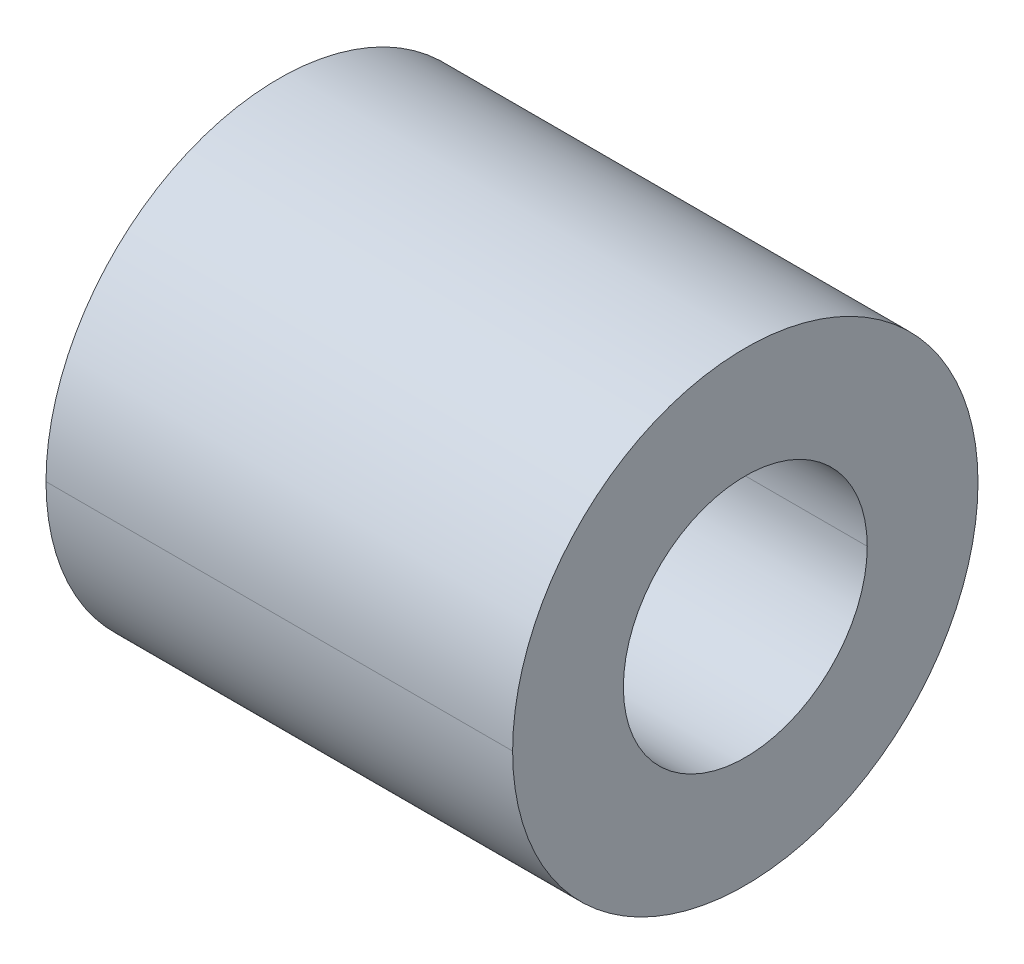
ISO-10303-21;
HEADER;
FILE_DESCRIPTION(('STEP AP214'),'2;1');
FILE_NAME('part.step','',(''),(''),'','','');
FILE_SCHEMA(('AUTOMOTIVE_DESIGN { 1 0 10303 214 1 1 1 1 }'));
ENDSEC;
DATA;
#1=APPLICATION_CONTEXT('core data for automotive mechanical design processes');
#2=APPLICATION_PROTOCOL_DEFINITION('international standard','automotive_design',2000,#1);
#3=PRODUCT_CONTEXT('',#1,'mechanical');
#4=PRODUCT('Part','Part','',(#3));
#5=PRODUCT_RELATED_PRODUCT_CATEGORY('part','',(#4));
#6=PRODUCT_DEFINITION_FORMATION('','',#4);
#7=PRODUCT_DEFINITION_CONTEXT('part definition',#1,'design');
#8=PRODUCT_DEFINITION('design','',#6,#7);
#9=PRODUCT_DEFINITION_SHAPE('','',#8);
#10=(LENGTH_UNIT() NAMED_UNIT(*) SI_UNIT(.MILLI.,.METRE.));
#11=(NAMED_UNIT(*) PLANE_ANGLE_UNIT() SI_UNIT($,.RADIAN.));
#12=(NAMED_UNIT(*) SI_UNIT($,.STERADIAN.) SOLID_ANGLE_UNIT());
#13=UNCERTAINTY_MEASURE_WITH_UNIT(LENGTH_MEASURE(1.E-05),#10,'distance_accuracy_value','');
#14=(GEOMETRIC_REPRESENTATION_CONTEXT(3) GLOBAL_UNCERTAINTY_ASSIGNED_CONTEXT((#13)) GLOBAL_UNIT_ASSIGNED_CONTEXT((#10,
#11,#12)) REPRESENTATION_CONTEXT('',''));
#15=CARTESIAN_POINT('',(0.,0.,0.));
#16=DIRECTION('',(0.,0.,1.));
#17=DIRECTION('',(1.,0.,0.));
#18=AXIS2_PLACEMENT_3D('',#15,#16,#17);
#19=CARTESIAN_POINT('',(4.7625,0.,0.));
#20=DIRECTION('',(-1.,0.,0.));
#21=DIRECTION('',(0.,0.,1.));
#22=AXIS2_PLACEMENT_3D('',#19,#20,#21);
#23=CYLINDRICAL_SURFACE('',#22,2.4892);
#24=DIRECTION('',(-1.,0.,0.));
#25=VECTOR('',#24,1.);
#26=CARTESIAN_POINT('',(4.7625,0.,-2.4892));
#27=LINE('',#26,#25);
#28=CARTESIAN_POINT('',(4.7625,0.,-2.4892));
#29=VERTEX_POINT('',#28);
#30=CARTESIAN_POINT('',(-4.7625,0.,-2.4892));
#31=VERTEX_POINT('',#30);
#32=EDGE_CURVE('E83',#29,#31,#27,.T.);
#33=ORIENTED_EDGE('',*,*,#32,.F.);
#34=CARTESIAN_POINT('',(4.7625,0.,0.));
#35=DIRECTION('',(1.,0.,0.));
#36=DIRECTION('',(0.,0.,-1.));
#37=AXIS2_PLACEMENT_3D('',#34,#35,#36);
#38=CIRCLE('',#37,2.4892);
#39=CARTESIAN_POINT('',(4.7625,0.,2.4892));
#40=VERTEX_POINT('',#39);
#41=EDGE_CURVE('E75',#29,#40,#38,.T.);
#42=ORIENTED_EDGE('',*,*,#41,.T.);
#43=DIRECTION('',(-1.,0.,0.));
#44=VECTOR('',#43,1.);
#45=CARTESIAN_POINT('',(4.7625,0.,2.4892));
#46=LINE('',#45,#44);
#47=CARTESIAN_POINT('',(-4.7625,0.,2.4892));
#48=VERTEX_POINT('',#47);
#49=EDGE_CURVE('E74',#40,#48,#46,.T.);
#50=ORIENTED_EDGE('',*,*,#49,.T.);
#51=CARTESIAN_POINT('',(-4.7625,0.,0.));
#52=DIRECTION('',(1.,0.,0.));
#53=DIRECTION('',(0.,0.,-1.));
#54=AXIS2_PLACEMENT_3D('',#51,#52,#53);
#55=CIRCLE('',#54,2.4892);
#56=EDGE_CURVE('E10',#31,#48,#55,.T.);
#57=ORIENTED_EDGE('',*,*,#56,.F.);
#58=EDGE_LOOP('',(#33,#42,#50,#57));
#59=FACE_BOUND('',#58,.T.);
#60=ADVANCED_FACE('F16',(#59),#23,.F.);
#61=CARTESIAN_POINT('',(4.7625,0.,0.));
#62=DIRECTION('',(-1.,0.,0.));
#63=DIRECTION('',(0.,0.,1.));
#64=AXIS2_PLACEMENT_3D('',#61,#62,#63);
#65=CYLINDRICAL_SURFACE('',#64,4.7498);
#66=DIRECTION('',(-1.,0.,0.));
#67=VECTOR('',#66,1.);
#68=CARTESIAN_POINT('',(4.7625,0.,-4.7498));
#69=LINE('',#68,#67);
#70=CARTESIAN_POINT('',(4.7625,0.,-4.7498));
#71=VERTEX_POINT('',#70);
#72=CARTESIAN_POINT('',(-4.7625,0.,-4.7498));
#73=VERTEX_POINT('',#72);
#74=EDGE_CURVE('E93',#71,#73,#69,.T.);
#75=ORIENTED_EDGE('',*,*,#74,.F.);
#76=CARTESIAN_POINT('',(4.7625,0.,0.));
#77=DIRECTION('',(1.,0.,0.));
#78=DIRECTION('',(0.,0.,-1.));
#79=AXIS2_PLACEMENT_3D('',#76,#77,#78);
#80=CIRCLE('',#79,4.7498);
#81=CARTESIAN_POINT('',(4.7625,0.,4.7498));
#82=VERTEX_POINT('',#81);
#83=EDGE_CURVE('E101',#82,#71,#80,.T.);
#84=ORIENTED_EDGE('',*,*,#83,.F.);
#85=DIRECTION('',(-1.,0.,0.));
#86=VECTOR('',#85,1.);
#87=CARTESIAN_POINT('',(4.7625,0.,4.7498));
#88=LINE('',#87,#86);
#89=CARTESIAN_POINT('',(-4.7625,0.,4.7498));
#90=VERTEX_POINT('',#89);
#91=EDGE_CURVE('E20',#82,#90,#88,.T.);
#92=ORIENTED_EDGE('',*,*,#91,.T.);
#93=CARTESIAN_POINT('',(-4.7625,0.,0.));
#94=DIRECTION('',(1.,0.,0.));
#95=DIRECTION('',(0.,0.,-1.));
#96=AXIS2_PLACEMENT_3D('',#93,#94,#95);
#97=CIRCLE('',#96,4.7498);
#98=EDGE_CURVE('E27',#90,#73,#97,.T.);
#99=ORIENTED_EDGE('',*,*,#98,.T.);
#100=EDGE_LOOP('',(#75,#84,#92,#99));
#101=FACE_BOUND('',#100,.T.);
#102=ADVANCED_FACE('F18',(#101),#65,.T.);
#103=CARTESIAN_POINT('',(-4.7625,0.,0.));
#104=DIRECTION('',(1.,0.,0.));
#105=DIRECTION('',(0.,1.,0.));
#106=AXIS2_PLACEMENT_3D('',#103,#104,#105);
#107=PLANE('',#106);
#108=CARTESIAN_POINT('',(-4.7625,0.,0.));
#109=DIRECTION('',(1.,0.,0.));
#110=DIRECTION('',(0.,0.,-1.));
#111=AXIS2_PLACEMENT_3D('',#108,#109,#110);
#112=CIRCLE('',#111,2.4892);
#113=EDGE_CURVE('E68',#48,#31,#112,.T.);
#114=ORIENTED_EDGE('',*,*,#113,.T.);
#115=ORIENTED_EDGE('',*,*,#56,.T.);
#116=EDGE_LOOP('',(#114,#115));
#117=FACE_BOUND('',#116,.T.);
#118=ORIENTED_EDGE('',*,*,#98,.F.);
#119=CARTESIAN_POINT('',(-4.7625,0.,0.));
#120=DIRECTION('',(1.,0.,0.));
#121=DIRECTION('',(0.,0.,-1.));
#122=AXIS2_PLACEMENT_3D('',#119,#120,#121);
#123=CIRCLE('',#122,4.7498);
#124=EDGE_CURVE('E96',#73,#90,#123,.T.);
#125=ORIENTED_EDGE('',*,*,#124,.F.);
#126=EDGE_LOOP('',(#118,#125));
#127=FACE_BOUND('',#126,.T.);
#128=ADVANCED_FACE('F66',(#117,#127),#107,.F.);
#129=CARTESIAN_POINT('',(4.7625,0.,0.));
#130=DIRECTION('',(1.,0.,0.));
#131=DIRECTION('',(0.,1.,0.));
#132=AXIS2_PLACEMENT_3D('',#129,#130,#131);
#133=PLANE('',#132);
#134=CARTESIAN_POINT('',(4.7625,0.,0.));
#135=DIRECTION('',(1.,0.,0.));
#136=DIRECTION('',(0.,0.,-1.));
#137=AXIS2_PLACEMENT_3D('',#134,#135,#136);
#138=CIRCLE('',#137,2.4892);
#139=EDGE_CURVE('E90',#40,#29,#138,.T.);
#140=ORIENTED_EDGE('',*,*,#139,.F.);
#141=ORIENTED_EDGE('',*,*,#41,.F.);
#142=EDGE_LOOP('',(#140,#141));
#143=FACE_BOUND('',#142,.T.);
#144=ORIENTED_EDGE('',*,*,#83,.T.);
#145=CARTESIAN_POINT('',(4.7625,0.,0.));
#146=DIRECTION('',(1.,0.,0.));
#147=DIRECTION('',(0.,0.,-1.));
#148=AXIS2_PLACEMENT_3D('',#145,#146,#147);
#149=CIRCLE('',#148,4.7498);
#150=EDGE_CURVE('E80',#71,#82,#149,.T.);
#151=ORIENTED_EDGE('',*,*,#150,.T.);
#152=EDGE_LOOP('',(#144,#151));
#153=FACE_BOUND('',#152,.T.);
#154=ADVANCED_FACE('F125',(#143,#153),#133,.T.);
#155=CARTESIAN_POINT('',(4.7625,0.,0.));
#156=DIRECTION('',(-1.,0.,0.));
#157=DIRECTION('',(0.,0.,1.));
#158=AXIS2_PLACEMENT_3D('',#155,#156,#157);
#159=CYLINDRICAL_SURFACE('',#158,4.7498);
#160=ORIENTED_EDGE('',*,*,#150,.F.);
#161=ORIENTED_EDGE('',*,*,#74,.T.);
#162=ORIENTED_EDGE('',*,*,#124,.T.);
#163=ORIENTED_EDGE('',*,*,#91,.F.);
#164=EDGE_LOOP('',(#160,#161,#162,#163));
#165=FACE_BOUND('',#164,.T.);
#166=ADVANCED_FACE('F135',(#165),#159,.T.);
#167=CARTESIAN_POINT('',(4.7625,0.,0.));
#168=DIRECTION('',(-1.,0.,0.));
#169=DIRECTION('',(0.,0.,1.));
#170=AXIS2_PLACEMENT_3D('',#167,#168,#169);
#171=CYLINDRICAL_SURFACE('',#170,2.4892);
#172=ORIENTED_EDGE('',*,*,#139,.T.);
#173=ORIENTED_EDGE('',*,*,#32,.T.);
#174=ORIENTED_EDGE('',*,*,#113,.F.);
#175=ORIENTED_EDGE('',*,*,#49,.F.);
#176=EDGE_LOOP('',(#172,#173,#174,#175));
#177=FACE_BOUND('',#176,.T.);
#178=ADVANCED_FACE('F82',(#177),#171,.F.);
#179=CLOSED_SHELL('',(#60,#102,#128,#154,#166,#178));
#180=MANIFOLD_SOLID_BREP('B1',#179);
#181=ADVANCED_BREP_SHAPE_REPRESENTATION('',(#18,#180),#14);
#182=SHAPE_DEFINITION_REPRESENTATION(#9,#181);
ENDSEC;
END-ISO-10303-21;
